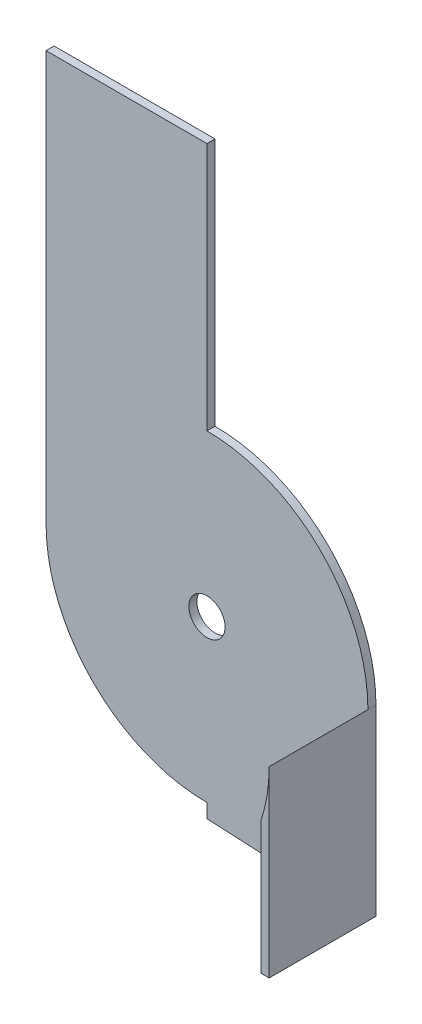
ISO-10303-21;
HEADER;
FILE_DESCRIPTION(('STEP AP214'),'2;1');
FILE_NAME('part.step','',(''),(''),'','','');
FILE_SCHEMA(('AUTOMOTIVE_DESIGN { 1 0 10303 214 1 1 1 1 }'));
ENDSEC;
DATA;
#1=APPLICATION_CONTEXT('core data for automotive mechanical design processes');
#2=APPLICATION_PROTOCOL_DEFINITION('international standard','automotive_design',2000,#1);
#3=PRODUCT_CONTEXT('',#1,'mechanical');
#4=PRODUCT('Part','Part','',(#3));
#5=PRODUCT_RELATED_PRODUCT_CATEGORY('part','',(#4));
#6=PRODUCT_DEFINITION_FORMATION('','',#4);
#7=PRODUCT_DEFINITION_CONTEXT('part definition',#1,'design');
#8=PRODUCT_DEFINITION('design','',#6,#7);
#9=PRODUCT_DEFINITION_SHAPE('','',#8);
#10=(LENGTH_UNIT() NAMED_UNIT(*) SI_UNIT(.MILLI.,.METRE.));
#11=(NAMED_UNIT(*) PLANE_ANGLE_UNIT() SI_UNIT($,.RADIAN.));
#12=(NAMED_UNIT(*) SI_UNIT($,.STERADIAN.) SOLID_ANGLE_UNIT());
#13=UNCERTAINTY_MEASURE_WITH_UNIT(LENGTH_MEASURE(1.E-05),#10,'distance_accuracy_value','');
#14=(GEOMETRIC_REPRESENTATION_CONTEXT(3) GLOBAL_UNCERTAINTY_ASSIGNED_CONTEXT((#13)) GLOBAL_UNIT_ASSIGNED_CONTEXT((#10,
#11,#12)) REPRESENTATION_CONTEXT('',''));
#15=CARTESIAN_POINT('',(0.,0.,0.));
#16=DIRECTION('',(0.,0.,1.));
#17=DIRECTION('',(1.,0.,0.));
#18=AXIS2_PLACEMENT_3D('',#15,#16,#17);
#19=CARTESIAN_POINT('',(0.,0.,2.));
#20=DIRECTION('',(0.,0.,1.));
#21=DIRECTION('',(1.,0.,0.));
#22=AXIS2_PLACEMENT_3D('',#19,#20,#21);
#23=PLANE('',#22);
#24=DIRECTION('',(0.,1.,0.));
#25=VECTOR('',#24,1.);
#26=CARTESIAN_POINT('',(28.,0.,2.));
#27=LINE('',#26,#25);
#28=CARTESIAN_POINT('',(28.,-44.9,2.));
#29=VERTEX_POINT('',#28);
#30=CARTESIAN_POINT('',(28.,-28.5657137141714,2.));
#31=VERTEX_POINT('',#30);
#32=EDGE_CURVE('E263',#29,#31,#27,.T.);
#33=ORIENTED_EDGE('',*,*,#32,.T.);
#34=CARTESIAN_POINT('',(0.,0.,2.));
#35=DIRECTION('',(0.,0.,1.));
#36=DIRECTION('',(1.,0.,0.));
#37=AXIS2_PLACEMENT_3D('',#34,#35,#36);
#38=CIRCLE('',#37,40.);
#39=CARTESIAN_POINT('',(40.,0.,2.));
#40=VERTEX_POINT('',#39);
#41=EDGE_CURVE('E142',#31,#40,#38,.T.);
#42=ORIENTED_EDGE('',*,*,#41,.T.);
#43=CARTESIAN_POINT('',(0.,0.,2.));
#44=DIRECTION('',(0.,0.,1.));
#45=DIRECTION('',(1.,0.,0.));
#46=AXIS2_PLACEMENT_3D('',#43,#44,#45);
#47=CIRCLE('',#46,40.);
#48=CARTESIAN_POINT('',(0.,40.,2.));
#49=VERTEX_POINT('',#48);
#50=EDGE_CURVE('E38',#40,#49,#47,.T.);
#51=ORIENTED_EDGE('',*,*,#50,.T.);
#52=DIRECTION('',(0.,1.,0.));
#53=VECTOR('',#52,1.);
#54=CARTESIAN_POINT('',(0.,101.855940277345,2.));
#55=LINE('',#54,#53);
#56=CARTESIAN_POINT('',(0.,101.855940277345,2.));
#57=VERTEX_POINT('',#56);
#58=EDGE_CURVE('E251',#49,#57,#55,.T.);
#59=ORIENTED_EDGE('',*,*,#58,.T.);
#60=DIRECTION('',(-1.,0.,0.));
#61=VECTOR('',#60,1.);
#62=CARTESIAN_POINT('',(-40.,101.855940277345,2.));
#63=LINE('',#62,#61);
#64=CARTESIAN_POINT('',(-40.,101.855940277345,2.));
#65=VERTEX_POINT('',#64);
#66=EDGE_CURVE('E248',#57,#65,#63,.T.);
#67=ORIENTED_EDGE('',*,*,#66,.T.);
#68=DIRECTION('',(0.,-1.,0.));
#69=VECTOR('',#68,1.);
#70=CARTESIAN_POINT('',(-40.,0.,2.));
#71=LINE('',#70,#69);
#72=CARTESIAN_POINT('',(-40.,0.,2.));
#73=VERTEX_POINT('',#72);
#74=EDGE_CURVE('E291',#65,#73,#71,.T.);
#75=ORIENTED_EDGE('',*,*,#74,.T.);
#76=CARTESIAN_POINT('',(0.,0.,2.));
#77=DIRECTION('',(0.,0.,1.));
#78=DIRECTION('',(1.,0.,0.));
#79=AXIS2_PLACEMENT_3D('',#76,#77,#78);
#80=CIRCLE('',#79,40.);
#81=CARTESIAN_POINT('',(0.,-40.,2.));
#82=VERTEX_POINT('',#81);
#83=EDGE_CURVE('E280',#73,#82,#80,.T.);
#84=ORIENTED_EDGE('',*,*,#83,.T.);
#85=DIRECTION('',(0.,-1.,0.));
#86=VECTOR('',#85,1.);
#87=CARTESIAN_POINT('',(0.,-45.,2.));
#88=LINE('',#87,#86);
#89=CARTESIAN_POINT('',(0.,-43.5,2.));
#90=VERTEX_POINT('',#89);
#91=EDGE_CURVE('E284',#82,#90,#88,.T.);
#92=ORIENTED_EDGE('',*,*,#91,.T.);
#93=DIRECTION('',(0.998752338877845,-0.0499376169438923,0.));
#94=VECTOR('',#93,1.);
#95=CARTESIAN_POINT('',(40.,-45.5,2.));
#96=LINE('',#95,#94);
#97=EDGE_CURVE('E159',#90,#29,#96,.T.);
#98=ORIENTED_EDGE('',*,*,#97,.T.);
#99=EDGE_LOOP('',(#33,#42,#51,#59,#67,#75,#84,#92,#98));
#100=FACE_BOUND('',#99,.T.);
#101=CARTESIAN_POINT('',(0.,0.,2.));
#102=DIRECTION('',(0.,0.,1.));
#103=DIRECTION('',(1.,0.,0.));
#104=AXIS2_PLACEMENT_3D('',#101,#102,#103);
#105=CIRCLE('',#104,4.5);
#106=CARTESIAN_POINT('',(4.5,0.,2.));
#107=VERTEX_POINT('',#106);
#108=EDGE_CURVE('E269',#107,#107,#105,.T.);
#109=ORIENTED_EDGE('',*,*,#108,.F.);
#110=EDGE_LOOP('',(#109));
#111=FACE_BOUND('',#110,.T.);
#112=ADVANCED_FACE('F33',(#100,#111),#23,.T.);
#113=CARTESIAN_POINT('',(0.,0.,40.));
#114=DIRECTION('',(0.,0.,-1.));
#115=DIRECTION('',(-1.,0.,0.));
#116=AXIS2_PLACEMENT_3D('',#113,#114,#115);
#117=CYLINDRICAL_SURFACE('',#116,40.);
#118=DIRECTION('',(0.,0.,-1.));
#119=VECTOR('',#118,1.);
#120=CARTESIAN_POINT('',(0.,40.,40.));
#121=LINE('',#120,#119);
#122=CARTESIAN_POINT('',(0.,40.,0.));
#123=VERTEX_POINT('',#122);
#124=EDGE_CURVE('E273',#49,#123,#121,.T.);
#125=ORIENTED_EDGE('',*,*,#124,.F.);
#126=ORIENTED_EDGE('',*,*,#50,.F.);
#127=DIRECTION('',(0.,0.,-1.));
#128=VECTOR('',#127,1.);
#129=CARTESIAN_POINT('',(40.,0.,40.));
#130=LINE('',#129,#128);
#131=CARTESIAN_POINT('',(40.,0.,0.));
#132=VERTEX_POINT('',#131);
#133=EDGE_CURVE('E243',#40,#132,#130,.T.);
#134=ORIENTED_EDGE('',*,*,#133,.T.);
#135=CARTESIAN_POINT('',(0.,0.,0.));
#136=DIRECTION('',(0.,0.,1.));
#137=DIRECTION('',(1.,0.,0.));
#138=AXIS2_PLACEMENT_3D('',#135,#136,#137);
#139=CIRCLE('',#138,40.);
#140=EDGE_CURVE('E173',#132,#123,#139,.T.);
#141=ORIENTED_EDGE('',*,*,#140,.T.);
#142=EDGE_LOOP('',(#125,#126,#134,#141));
#143=FACE_BOUND('',#142,.T.);
#144=ADVANCED_FACE('F190',(#143),#117,.T.);
#145=CARTESIAN_POINT('',(38.,-45.5,26.5412424775573));
#146=DIRECTION('',(0.,0.,1.));
#147=DIRECTION('',(1.,0.,0.));
#148=AXIS2_PLACEMENT_3D('',#145,#146,#147);
#149=PLANE('',#148);
#150=DIRECTION('',(0.,-1.,0.));
#151=VECTOR('',#150,1.);
#152=CARTESIAN_POINT('',(40.,-45.5,26.5412424775573));
#153=LINE('',#152,#151);
#154=CARTESIAN_POINT('',(40.,0.,26.5412424775573));
#155=VERTEX_POINT('',#154);
#156=CARTESIAN_POINT('',(40.,-45.5,26.5412424775573));
#157=VERTEX_POINT('',#156);
#158=EDGE_CURVE('E170',#155,#157,#153,.T.);
#159=ORIENTED_EDGE('',*,*,#158,.F.);
#160=CARTESIAN_POINT('',(0.,0.,26.5412424775573));
#161=DIRECTION('',(0.,0.,1.));
#162=DIRECTION('',(1.,0.,0.));
#163=AXIS2_PLACEMENT_3D('',#160,#161,#162);
#164=CIRCLE('',#163,40.);
#165=CARTESIAN_POINT('',(38.,-12.4899959967968,26.5412424775573));
#166=VERTEX_POINT('',#165);
#167=EDGE_CURVE('E53',#155,#166,#164,.F.);
#168=ORIENTED_EDGE('',*,*,#167,.T.);
#169=DIRECTION('',(0.,-1.,0.));
#170=VECTOR('',#169,1.);
#171=CARTESIAN_POINT('',(38.,0.,26.5412424775573));
#172=LINE('',#171,#170);
#173=CARTESIAN_POINT('',(38.,-45.5,26.5412424775573));
#174=VERTEX_POINT('',#173);
#175=EDGE_CURVE('E167',#166,#174,#172,.T.);
#176=ORIENTED_EDGE('',*,*,#175,.T.);
#177=DIRECTION('',(1.,0.,0.));
#178=VECTOR('',#177,1.);
#179=CARTESIAN_POINT('',(38.,-45.5,26.5412424775573));
#180=LINE('',#179,#178);
#181=EDGE_CURVE('E156',#174,#157,#180,.T.);
#182=ORIENTED_EDGE('',*,*,#181,.T.);
#183=EDGE_LOOP('',(#159,#168,#176,#182));
#184=FACE_BOUND('',#183,.T.);
#185=ADVANCED_FACE('F193',(#184),#149,.T.);
#186=CARTESIAN_POINT('',(38.,0.,0.));
#187=DIRECTION('',(1.,0.,0.));
#188=DIRECTION('',(0.,1.,0.));
#189=AXIS2_PLACEMENT_3D('',#186,#187,#188);
#190=PLANE('',#189);
#191=DIRECTION('',(0.,0.,-1.));
#192=VECTOR('',#191,1.);
#193=CARTESIAN_POINT('',(38.,-12.4899959967968,84.));
#194=LINE('',#193,#192);
#195=CARTESIAN_POINT('',(38.,-12.4899959967968,12.));
#196=VERTEX_POINT('',#195);
#197=EDGE_CURVE('E11',#196,#166,#194,.F.);
#198=ORIENTED_EDGE('',*,*,#197,.F.);
#199=DIRECTION('',(0.,1.,0.));
#200=VECTOR('',#199,1.);
#201=CARTESIAN_POINT('',(38.,0.,12.));
#202=LINE('',#201,#200);
#203=CARTESIAN_POINT('',(38.,-45.4,12.));
#204=VERTEX_POINT('',#203);
#205=EDGE_CURVE('E315',#196,#204,#202,.F.);
#206=ORIENTED_EDGE('',*,*,#205,.T.);
#207=DIRECTION('',(0.,0.,-1.));
#208=VECTOR('',#207,1.);
#209=CARTESIAN_POINT('',(38.,-45.4,0.));
#210=LINE('',#209,#208);
#211=CARTESIAN_POINT('',(38.,-45.4,2.));
#212=VERTEX_POINT('',#211);
#213=EDGE_CURVE('E150',#204,#212,#210,.T.);
#214=ORIENTED_EDGE('',*,*,#213,.T.);
#215=DIRECTION('',(0.,1.,0.));
#216=VECTOR('',#215,1.);
#217=CARTESIAN_POINT('',(38.,-45.5,2.));
#218=LINE('',#217,#216);
#219=CARTESIAN_POINT('',(38.,-45.5,2.));
#220=VERTEX_POINT('',#219);
#221=EDGE_CURVE('E135',#220,#212,#218,.T.);
#222=ORIENTED_EDGE('',*,*,#221,.F.);
#223=DIRECTION('',(0.,0.,-1.));
#224=VECTOR('',#223,1.);
#225=CARTESIAN_POINT('',(38.,-45.5,2.));
#226=LINE('',#225,#224);
#227=EDGE_CURVE('E143',#174,#220,#226,.T.);
#228=ORIENTED_EDGE('',*,*,#227,.F.);
#229=ORIENTED_EDGE('',*,*,#175,.F.);
#230=EDGE_LOOP('',(#198,#206,#214,#222,#228,#229));
#231=FACE_BOUND('',#230,.T.);
#232=ADVANCED_FACE('F147',(#231),#190,.F.);
#233=CARTESIAN_POINT('',(28.,0.,12.));
#234=DIRECTION('',(0.,1.,0.));
#235=DIRECTION('',(-1.,0.,0.));
#236=AXIS2_PLACEMENT_3D('',#233,#234,#235);
#237=CYLINDRICAL_SURFACE('',#236,10.);
#238=CARTESIAN_POINT('',(28.,-28.5657137141714,2.));
#239=CARTESIAN_POINT('',(28.2025228124265,-28.3672074264276,2.0000085537167));
#240=CARTESIAN_POINT('',(28.4028832634662,-28.1665852678706,2.006151328741));
#241=CARTESIAN_POINT('',(28.7989171672831,-27.7615295538624,2.0299894323125));
#242=CARTESIAN_POINT('',(28.9945917660297,-27.5570969524961,2.04768190573324));
#243=CARTESIAN_POINT('',(29.5735668944114,-26.9392322248397,2.11694057982785));
#244=CARTESIAN_POINT('',(29.9494761251845,-26.5205883841425,2.18469274054019));
#245=CARTESIAN_POINT('',(30.6803833588562,-25.6715579807608,2.35857571788483));
#246=CARTESIAN_POINT('',(31.0353274623921,-25.2411449866765,2.46480084166322));
#247=CARTESIAN_POINT('',(31.7225677683226,-24.371822936993,2.71152119480707));
#248=CARTESIAN_POINT('',(32.0548534282544,-23.9329100468939,2.85203223930288));
#249=CARTESIAN_POINT('',(32.5827647858697,-23.2053480961867,3.10891442766447));
#250=CARTESIAN_POINT('',(32.7852005516042,-22.9183893245452,3.21627877404944));
#251=CARTESIAN_POINT('',(33.1802666521376,-22.3425998006927,3.44332147820077));
#252=CARTESIAN_POINT('',(33.3728972999456,-22.0537691085713,3.56299944251));
#253=CARTESIAN_POINT('',(33.7484133971349,-21.4747232883278,3.81423158157918));
#254=CARTESIAN_POINT('',(33.9312939874607,-21.1845075470096,3.94579159151825));
#255=CARTESIAN_POINT('',(34.2871969213171,-20.6034990832447,4.22043185603089));
#256=CARTESIAN_POINT('',(34.4602195843764,-20.3127063798159,4.36351173684332));
#257=CARTESIAN_POINT('',(34.796002823541,-19.7319644071805,4.66075563568618));
#258=CARTESIAN_POINT('',(34.9587868188762,-19.4420147763669,4.8148924935051));
#259=CARTESIAN_POINT('',(35.2745074887202,-18.8631333203035,5.13472199000676));
#260=CARTESIAN_POINT('',(35.4274444155968,-18.5742014691489,5.30041433231032));
#261=CARTESIAN_POINT('',(35.7232754525818,-17.998671843158,5.64371773411044));
#262=CARTESIAN_POINT('',(35.86617793708,-17.7120723028203,5.8213186072109));
#263=CARTESIAN_POINT('',(36.1419063584023,-17.1424223306959,6.18946802351868));
#264=CARTESIAN_POINT('',(36.2747346501886,-16.8593710824476,6.38001352090001));
#265=CARTESIAN_POINT('',(36.4781141554721,-16.4128187415995,6.69518570966189));
#266=CARTESIAN_POINT('',(36.5520235374753,-16.2475133800545,6.81510545345728));
#267=CARTESIAN_POINT('',(36.6960923400329,-15.919449802847,7.0605427800478));
#268=CARTESIAN_POINT('',(36.7662520426529,-15.7566913962458,7.18605994047663));
#269=CARTESIAN_POINT('',(36.9028129156281,-15.4341545088788,7.44355353645612));
#270=CARTESIAN_POINT('',(36.9692064925965,-15.2743824555861,7.57554208656351));
#271=CARTESIAN_POINT('',(37.0978704628682,-14.9591768995677,7.84653681952036));
#272=CARTESIAN_POINT('',(37.160141056774,-14.8037431859747,7.98554266036512));
#273=CARTESIAN_POINT('',(37.280876442328,-14.4970232945411,8.27308301483886));
#274=CARTESIAN_POINT('',(37.3392946731566,-14.3457974178361,8.42170191044942));
#275=CARTESIAN_POINT('',(37.4511482932261,-14.0512031439676,8.72853508911078));
#276=CARTESIAN_POINT('',(37.5045812280189,-13.9078386314194,8.88675403602362));
#277=CARTESIAN_POINT('',(37.6055291104763,-13.6325194872056,9.21378132192473));
#278=CARTESIAN_POINT('',(37.6530628447437,-13.5005290666686,9.38255332896824));
#279=CARTESIAN_POINT('',(37.7412396452091,-13.252025059594,9.7326712313474));
#280=CARTESIAN_POINT('',(37.7818921331831,-13.135490359284,9.91399944717813));
#281=CARTESIAN_POINT('',(37.8533998628707,-12.9279441792743,10.2839805825523));
#282=CARTESIAN_POINT('',(37.8845548352284,-12.8361656023428,10.4721356551194));
#283=CARTESIAN_POINT('',(37.9367983598445,-12.6809345264178,10.8606635581822));
#284=CARTESIAN_POINT('',(37.9579302216612,-12.6173602360844,11.0609795252238));
#285=CARTESIAN_POINT('',(37.9818339420956,-12.5451628621503,11.3856271834982));
#286=CARTESIAN_POINT('',(37.9885851108958,-12.5246858615013,11.5070635799941));
#287=CARTESIAN_POINT('',(37.9976959453536,-12.497006519936,11.7522801520559));
#288=CARTESIAN_POINT('',(38.0000306787746,-12.4898795465237,11.8760696726472));
#289=CARTESIAN_POINT('',(38.,-12.4899959967968,12.));
#290=B_SPLINE_CURVE_WITH_KNOTS('',3,(#238,#239,#240,#241,#242,#243,#244,#245,#246,#247,#248,
#249,#250,#251,#252,#253,#254,#255,#256,#257,#258,#259,#260,#261,#262,#263,#264,#265,#266,#267,
#268,#269,#270,#271,#272,#273,#274,#275,#276,#277,#278,#279,#280,#281,#282,#283,#284,#285,#286,
#287,#288,#289),.UNSPECIFIED.,.F.,.F.,(4,2,2,2,2,2,2,2,2,2,2,2,2,2,2,2,2,2,2,2,2,2,2,2,2,4),(0.,
0.850563043355811,1.70091590408788,3.3988691715542,5.10101304585366,6.8039435604105,
7.90530327094066,9.00662780063768,10.108496153943,11.2103287716283,12.3095418838514,
13.4087268134261,14.5069832226371,15.6049821049618,16.2564375521502,16.9078439251325,
17.5605201312742,18.2131645583097,18.8726278521326,19.53241412983,20.1900421791279,
20.8467623925839,21.4798678759267,22.1102122301163,22.4794578211721,22.8507817758367),.UNSPECIFIED.);
#291=EDGE_CURVE('E45',#31,#196,#290,.T.);
#292=ORIENTED_EDGE('',*,*,#291,.F.);
#293=ORIENTED_EDGE('',*,*,#32,.F.);
#294=CARTESIAN_POINT('',(28.,-44.9,12.));
#295=DIRECTION('',(-0.0499376169438923,-0.998752338877845,0.));
#296=DIRECTION('',(-0.998752338877845,0.0499376169438923,0.));
#297=AXIS2_PLACEMENT_3D('',#294,#295,#296);
#298=ELLIPSE('',#297,10.0124921972504,10.);
#299=EDGE_CURVE('E151',#204,#29,#298,.F.);
#300=ORIENTED_EDGE('',*,*,#299,.F.);
#301=ORIENTED_EDGE('',*,*,#205,.F.);
#302=EDGE_LOOP('',(#292,#293,#300,#301));
#303=FACE_BOUND('',#302,.T.);
#304=ADVANCED_FACE('F184',(#303),#237,.F.);
#305=CARTESIAN_POINT('',(-40.,101.855940277345,40.));
#306=DIRECTION('',(0.,-1.,0.));
#307=DIRECTION('',(0.,0.,-1.));
#308=AXIS2_PLACEMENT_3D('',#305,#306,#307);
#309=PLANE('',#308);
#310=ORIENTED_EDGE('',*,*,#66,.F.);
#311=DIRECTION('',(0.,0.,-1.));
#312=VECTOR('',#311,1.);
#313=CARTESIAN_POINT('',(0.,101.855940277345,40.));
#314=LINE('',#313,#312);
#315=CARTESIAN_POINT('',(0.,101.855940277345,0.));
#316=VERTEX_POINT('',#315);
#317=EDGE_CURVE('E278',#57,#316,#314,.T.);
#318=ORIENTED_EDGE('',*,*,#317,.T.);
#319=DIRECTION('',(-1.,0.,0.));
#320=VECTOR('',#319,1.);
#321=CARTESIAN_POINT('',(-40.,101.855940277345,0.));
#322=LINE('',#321,#320);
#323=CARTESIAN_POINT('',(-40.,101.855940277345,0.));
#324=VERTEX_POINT('',#323);
#325=EDGE_CURVE('E277',#316,#324,#322,.T.);
#326=ORIENTED_EDGE('',*,*,#325,.T.);
#327=DIRECTION('',(0.,0.,-1.));
#328=VECTOR('',#327,1.);
#329=CARTESIAN_POINT('',(-40.,101.855940277345,40.));
#330=LINE('',#329,#328);
#331=EDGE_CURVE('E281',#65,#324,#330,.T.);
#332=ORIENTED_EDGE('',*,*,#331,.F.);
#333=EDGE_LOOP('',(#310,#318,#326,#332));
#334=FACE_BOUND('',#333,.T.);
#335=ADVANCED_FACE('F188',(#334),#309,.F.);
#336=CARTESIAN_POINT('',(0.,101.855940277345,40.));
#337=DIRECTION('',(-1.,0.,0.));
#338=DIRECTION('',(0.,0.,1.));
#339=AXIS2_PLACEMENT_3D('',#336,#337,#338);
#340=PLANE('',#339);
#341=ORIENTED_EDGE('',*,*,#58,.F.);
#342=ORIENTED_EDGE('',*,*,#124,.T.);
#343=DIRECTION('',(0.,1.,0.));
#344=VECTOR('',#343,1.);
#345=CARTESIAN_POINT('',(0.,101.855940277345,0.));
#346=LINE('',#345,#344);
#347=EDGE_CURVE('E276',#123,#316,#346,.T.);
#348=ORIENTED_EDGE('',*,*,#347,.T.);
#349=ORIENTED_EDGE('',*,*,#317,.F.);
#350=EDGE_LOOP('',(#341,#342,#348,#349));
#351=FACE_BOUND('',#350,.T.);
#352=ADVANCED_FACE('F208',(#351),#340,.F.);
#353=CARTESIAN_POINT('',(-40.,0.,40.));
#354=DIRECTION('',(1.,0.,0.));
#355=DIRECTION('',(0.,0.,-1.));
#356=AXIS2_PLACEMENT_3D('',#353,#354,#355);
#357=PLANE('',#356);
#358=ORIENTED_EDGE('',*,*,#74,.F.);
#359=ORIENTED_EDGE('',*,*,#331,.T.);
#360=DIRECTION('',(0.,-1.,0.));
#361=VECTOR('',#360,1.);
#362=CARTESIAN_POINT('',(-40.,0.,0.));
#363=LINE('',#362,#361);
#364=CARTESIAN_POINT('',(-40.,0.,0.));
#365=VERTEX_POINT('',#364);
#366=EDGE_CURVE('E283',#324,#365,#363,.T.);
#367=ORIENTED_EDGE('',*,*,#366,.T.);
#368=DIRECTION('',(0.,0.,-1.));
#369=VECTOR('',#368,1.);
#370=CARTESIAN_POINT('',(-40.,0.,40.));
#371=LINE('',#370,#369);
#372=EDGE_CURVE('E256',#73,#365,#371,.T.);
#373=ORIENTED_EDGE('',*,*,#372,.F.);
#374=EDGE_LOOP('',(#358,#359,#367,#373));
#375=FACE_BOUND('',#374,.T.);
#376=ADVANCED_FACE('F204',(#375),#357,.F.);
#377=CARTESIAN_POINT('',(0.,0.,40.));
#378=DIRECTION('',(0.,0.,-1.));
#379=DIRECTION('',(-1.,0.,0.));
#380=AXIS2_PLACEMENT_3D('',#377,#378,#379);
#381=CYLINDRICAL_SURFACE('',#380,40.);
#382=ORIENTED_EDGE('',*,*,#83,.F.);
#383=ORIENTED_EDGE('',*,*,#372,.T.);
#384=CARTESIAN_POINT('',(0.,0.,0.));
#385=DIRECTION('',(0.,0.,1.));
#386=DIRECTION('',(1.,0.,0.));
#387=AXIS2_PLACEMENT_3D('',#384,#385,#386);
#388=CIRCLE('',#387,40.);
#389=CARTESIAN_POINT('',(0.,-40.,0.));
#390=VERTEX_POINT('',#389);
#391=EDGE_CURVE('E177',#365,#390,#388,.T.);
#392=ORIENTED_EDGE('',*,*,#391,.T.);
#393=DIRECTION('',(0.,0.,-1.));
#394=VECTOR('',#393,1.);
#395=CARTESIAN_POINT('',(0.,-40.,40.));
#396=LINE('',#395,#394);
#397=EDGE_CURVE('E270',#82,#390,#396,.T.);
#398=ORIENTED_EDGE('',*,*,#397,.F.);
#399=EDGE_LOOP('',(#382,#383,#392,#398));
#400=FACE_BOUND('',#399,.T.);
#401=ADVANCED_FACE('F200',(#400),#381,.T.);
#402=CARTESIAN_POINT('',(40.,0.,40.));
#403=DIRECTION('',(-1.,0.,0.));
#404=DIRECTION('',(0.,-1.,0.));
#405=AXIS2_PLACEMENT_3D('',#402,#403,#404);
#406=PLANE('',#405);
#407=ORIENTED_EDGE('',*,*,#133,.F.);
#408=DIRECTION('',(0.,0.,-1.));
#409=VECTOR('',#408,1.);
#410=CARTESIAN_POINT('',(40.,0.,84.));
#411=LINE('',#410,#409);
#412=EDGE_CURVE('E172',#40,#155,#411,.F.);
#413=ORIENTED_EDGE('',*,*,#412,.T.);
#414=ORIENTED_EDGE('',*,*,#158,.T.);
#415=DIRECTION('',(0.,0.,-1.));
#416=VECTOR('',#415,1.);
#417=CARTESIAN_POINT('',(40.,-45.5,2.));
#418=LINE('',#417,#416);
#419=CARTESIAN_POINT('',(40.,-45.5,2.));
#420=VERTEX_POINT('',#419);
#421=EDGE_CURVE('E161',#157,#420,#418,.T.);
#422=ORIENTED_EDGE('',*,*,#421,.T.);
#423=DIRECTION('',(0.,0.,1.));
#424=VECTOR('',#423,1.);
#425=CARTESIAN_POINT('',(40.,-45.5,-40.0499687890016));
#426=LINE('',#425,#424);
#427=CARTESIAN_POINT('',(40.,-45.5,0.));
#428=VERTEX_POINT('',#427);
#429=EDGE_CURVE('E308',#428,#420,#426,.T.);
#430=ORIENTED_EDGE('',*,*,#429,.F.);
#431=DIRECTION('',(0.,1.,0.));
#432=VECTOR('',#431,1.);
#433=CARTESIAN_POINT('',(40.,0.,0.));
#434=LINE('',#433,#432);
#435=EDGE_CURVE('E246',#428,#132,#434,.T.);
#436=ORIENTED_EDGE('',*,*,#435,.T.);
#437=EDGE_LOOP('',(#407,#413,#414,#422,#430,#436));
#438=FACE_BOUND('',#437,.T.);
#439=ADVANCED_FACE('F203',(#438),#406,.F.);
#440=CARTESIAN_POINT('',(0.,0.,0.));
#441=DIRECTION('',(0.,0.,1.));
#442=DIRECTION('',(1.,0.,0.));
#443=AXIS2_PLACEMENT_3D('',#440,#441,#442);
#444=PLANE('',#443);
#445=ORIENTED_EDGE('',*,*,#435,.F.);
#446=DIRECTION('',(-0.998752338877845,0.0499376169438923,0.));
#447=VECTOR('',#446,1.);
#448=CARTESIAN_POINT('',(40.,-45.5,0.));
#449=LINE('',#448,#447);
#450=CARTESIAN_POINT('',(0.,-43.5,0.));
#451=VERTEX_POINT('',#450);
#452=EDGE_CURVE('E259',#428,#451,#449,.T.);
#453=ORIENTED_EDGE('',*,*,#452,.T.);
#454=DIRECTION('',(0.,1.,0.));
#455=VECTOR('',#454,1.);
#456=CARTESIAN_POINT('',(0.,-45.,0.));
#457=LINE('',#456,#455);
#458=EDGE_CURVE('E272',#451,#390,#457,.T.);
#459=ORIENTED_EDGE('',*,*,#458,.T.);
#460=ORIENTED_EDGE('',*,*,#391,.F.);
#461=ORIENTED_EDGE('',*,*,#366,.F.);
#462=ORIENTED_EDGE('',*,*,#325,.F.);
#463=ORIENTED_EDGE('',*,*,#347,.F.);
#464=ORIENTED_EDGE('',*,*,#140,.F.);
#465=EDGE_LOOP('',(#445,#453,#459,#460,#461,#462,#463,#464));
#466=FACE_BOUND('',#465,.T.);
#467=CARTESIAN_POINT('',(0.,0.,0.));
#468=DIRECTION('',(0.,0.,1.));
#469=DIRECTION('',(1.,0.,0.));
#470=AXIS2_PLACEMENT_3D('',#467,#468,#469);
#471=CIRCLE('',#470,4.5);
#472=CARTESIAN_POINT('',(4.5,0.,0.));
#473=VERTEX_POINT('',#472);
#474=EDGE_CURVE('E298',#473,#473,#471,.F.);
#475=ORIENTED_EDGE('',*,*,#474,.F.);
#476=EDGE_LOOP('',(#475));
#477=FACE_BOUND('',#476,.T.);
#478=ADVANCED_FACE('F198',(#466,#477),#444,.F.);
#479=CARTESIAN_POINT('',(0.,-45.,40.));
#480=DIRECTION('',(1.,0.,0.));
#481=DIRECTION('',(0.,0.,-1.));
#482=AXIS2_PLACEMENT_3D('',#479,#480,#481);
#483=PLANE('',#482);
#484=ORIENTED_EDGE('',*,*,#91,.F.);
#485=ORIENTED_EDGE('',*,*,#397,.T.);
#486=ORIENTED_EDGE('',*,*,#458,.F.);
#487=DIRECTION('',(0.,0.,1.));
#488=VECTOR('',#487,1.);
#489=CARTESIAN_POINT('',(0.,-43.5,-40.0281151192509));
#490=LINE('',#489,#488);
#491=EDGE_CURVE('E267',#451,#90,#490,.T.);
#492=ORIENTED_EDGE('',*,*,#491,.T.);
#493=EDGE_LOOP('',(#484,#485,#486,#492));
#494=FACE_BOUND('',#493,.T.);
#495=ADVANCED_FACE('F194',(#494),#483,.F.);
#496=CARTESIAN_POINT('',(0.,0.,-12.7279220613579));
#497=DIRECTION('',(0.,0.,1.));
#498=DIRECTION('',(1.,0.,0.));
#499=AXIS2_PLACEMENT_3D('',#496,#497,#498);
#500=CYLINDRICAL_SURFACE('',#499,4.5);
#501=CARTESIAN_POINT('',(4.5,0.,2.));
#502=CARTESIAN_POINT('',(4.5,0.,1.97916666666667));
#503=CARTESIAN_POINT('',(4.5,0.,1.95833333333333));
#504=CARTESIAN_POINT('',(4.5,0.,1.91666666666667));
#505=CARTESIAN_POINT('',(4.5,0.,1.89583333333333));
#506=CARTESIAN_POINT('',(4.5,0.,1.85416666666667));
#507=CARTESIAN_POINT('',(4.5,0.,1.83333333333333));
#508=CARTESIAN_POINT('',(4.5,0.,1.79166666666667));
#509=CARTESIAN_POINT('',(4.5,0.,1.77083333333333));
#510=CARTESIAN_POINT('',(4.5,0.,1.72916666666667));
#511=CARTESIAN_POINT('',(4.5,0.,1.70833333333333));
#512=CARTESIAN_POINT('',(4.5,0.,1.66666666666667));
#513=CARTESIAN_POINT('',(4.5,0.,1.64583333333333));
#514=CARTESIAN_POINT('',(4.5,0.,1.60416666666667));
#515=CARTESIAN_POINT('',(4.5,0.,1.58333333333333));
#516=CARTESIAN_POINT('',(4.5,0.,1.54166666666667));
#517=CARTESIAN_POINT('',(4.5,0.,1.52083333333333));
#518=CARTESIAN_POINT('',(4.5,0.,1.47916666666667));
#519=CARTESIAN_POINT('',(4.5,0.,1.45833333333333));
#520=CARTESIAN_POINT('',(4.5,0.,1.41666666666667));
#521=CARTESIAN_POINT('',(4.5,0.,1.39583333333333));
#522=CARTESIAN_POINT('',(4.5,0.,1.35416666666667));
#523=CARTESIAN_POINT('',(4.5,0.,1.33333333333333));
#524=CARTESIAN_POINT('',(4.5,0.,1.29166666666667));
#525=CARTESIAN_POINT('',(4.5,0.,1.27083333333333));
#526=CARTESIAN_POINT('',(4.5,0.,1.22916666666667));
#527=CARTESIAN_POINT('',(4.5,0.,1.20833333333333));
#528=CARTESIAN_POINT('',(4.5,0.,1.16666666666667));
#529=CARTESIAN_POINT('',(4.5,0.,1.14583333333333));
#530=CARTESIAN_POINT('',(4.5,0.,1.10416666666667));
#531=CARTESIAN_POINT('',(4.5,0.,1.08333333333333));
#532=CARTESIAN_POINT('',(4.5,0.,1.04166666666667));
#533=CARTESIAN_POINT('',(4.5,0.,1.02083333333333));
#534=CARTESIAN_POINT('',(4.5,0.,0.979166666666666));
#535=CARTESIAN_POINT('',(4.5,0.,0.958333333333332));
#536=CARTESIAN_POINT('',(4.5,0.,0.916666666666666));
#537=CARTESIAN_POINT('',(4.5,0.,0.895833333333332));
#538=CARTESIAN_POINT('',(4.5,0.,0.854166666666666));
#539=CARTESIAN_POINT('',(4.5,0.,0.833333333333332));
#540=CARTESIAN_POINT('',(4.5,0.,0.791666666666666));
#541=CARTESIAN_POINT('',(4.5,0.,0.770833333333332));
#542=CARTESIAN_POINT('',(4.5,0.,0.729166666666666));
#543=CARTESIAN_POINT('',(4.5,0.,0.708333333333332));
#544=CARTESIAN_POINT('',(4.5,0.,0.666666666666666));
#545=CARTESIAN_POINT('',(4.5,0.,0.645833333333332));
#546=CARTESIAN_POINT('',(4.5,0.,0.604166666666666));
#547=CARTESIAN_POINT('',(4.5,0.,0.583333333333332));
#548=CARTESIAN_POINT('',(4.5,0.,0.541666666666665));
#549=CARTESIAN_POINT('',(4.5,0.,0.520833333333332));
#550=CARTESIAN_POINT('',(4.5,0.,0.479166666666665));
#551=CARTESIAN_POINT('',(4.5,0.,0.458333333333332));
#552=CARTESIAN_POINT('',(4.5,0.,0.416666666666665));
#553=CARTESIAN_POINT('',(4.5,0.,0.395833333333332));
#554=CARTESIAN_POINT('',(4.5,0.,0.354166666666665));
#555=CARTESIAN_POINT('',(4.5,0.,0.333333333333332));
#556=CARTESIAN_POINT('',(4.5,0.,0.291666666666665));
#557=CARTESIAN_POINT('',(4.5,0.,0.270833333333332));
#558=CARTESIAN_POINT('',(4.5,0.,0.229166666666665));
#559=CARTESIAN_POINT('',(4.5,0.,0.208333333333332));
#560=CARTESIAN_POINT('',(4.5,0.,0.166666666666665));
#561=CARTESIAN_POINT('',(4.5,0.,0.145833333333332));
#562=CARTESIAN_POINT('',(4.5,0.,0.104166666666665));
#563=CARTESIAN_POINT('',(4.5,0.,0.0833333333333317));
#564=CARTESIAN_POINT('',(4.5,0.,0.041666666666665));
#565=CARTESIAN_POINT('',(4.5,0.,0.0208333333333316));
#566=CARTESIAN_POINT('',(4.5,0.,0.));
#567=B_SPLINE_CURVE_WITH_KNOTS('',3,(#501,#502,#503,#504,#505,#506,#507,#508,#509,#510,#511,
#512,#513,#514,#515,#516,#517,#518,#519,#520,#521,#522,#523,#524,#525,#526,#527,#528,#529,#530,
#531,#532,#533,#534,#535,#536,#537,#538,#539,#540,#541,#542,#543,#544,#545,#546,#547,#548,#549,
#550,#551,#552,#553,#554,#555,#556,#557,#558,#559,#560,#561,#562,#563,#564,#565,#566),
.UNSPECIFIED.,.F.,.F.,(4,2,2,2,2,2,2,2,2,2,2,2,2,2,2,2,2,2,2,2,2,2,2,2,2,2,2,2,2,2,2,2,4),(0.,
0.0625000000000001,0.125,0.1875,0.25,0.3125,0.375,0.4375,0.5,0.5625,0.625000000000001,
0.687500000000001,0.750000000000001,0.812500000000001,0.875000000000001,0.937500000000001,1.,
1.0625,1.125,1.1875,1.25,1.3125,1.375,1.4375,1.5,1.5625,1.625,1.6875,1.75,1.8125,1.875,1.9375,
2.),.UNSPECIFIED.);
#568=EDGE_CURVE('BSEAM197',#107,#473,#567,.T.);
#569=ORIENTED_EDGE('',*,*,#108,.T.);
#570=ORIENTED_EDGE('',*,*,#474,.T.);
#571=ORIENTED_EDGE('',*,*,#568,.T.);
#572=ORIENTED_EDGE('',*,*,#568,.F.);
#573=EDGE_LOOP('',(#569,#571,#570,#572));
#574=FACE_BOUND('',#573,.T.);
#575=ADVANCED_FACE('F197',(#574),#500,.F.);
#576=CARTESIAN_POINT('',(40.,-45.5,-40.0499687890016));
#577=DIRECTION('',(-0.0499376169438923,-0.998752338877845,0.));
#578=DIRECTION('',(0.998752338877845,-0.0499376169438923,0.));
#579=AXIS2_PLACEMENT_3D('',#576,#577,#578);
#580=PLANE('',#579);
#581=ORIENTED_EDGE('',*,*,#452,.F.);
#582=ORIENTED_EDGE('',*,*,#429,.T.);
#583=EDGE_CURVE('E137',#212,#420,#96,.T.);
#584=ORIENTED_EDGE('',*,*,#583,.F.);
#585=ORIENTED_EDGE('',*,*,#213,.F.);
#586=ORIENTED_EDGE('',*,*,#299,.T.);
#587=ORIENTED_EDGE('',*,*,#97,.F.);
#588=ORIENTED_EDGE('',*,*,#491,.F.);
#589=EDGE_LOOP('',(#581,#582,#584,#585,#586,#587,#588));
#590=FACE_BOUND('',#589,.T.);
#591=ADVANCED_FACE('F218',(#590),#580,.T.);
#592=CARTESIAN_POINT('',(38.,0.,2.));
#593=DIRECTION('',(0.,0.,-1.));
#594=DIRECTION('',(-1.,0.,0.));
#595=AXIS2_PLACEMENT_3D('',#592,#593,#594);
#596=PLANE('',#595);
#597=ORIENTED_EDGE('',*,*,#221,.T.);
#598=ORIENTED_EDGE('',*,*,#583,.T.);
#599=DIRECTION('',(1.,0.,0.));
#600=VECTOR('',#599,1.);
#601=CARTESIAN_POINT('',(38.,-45.5,2.));
#602=LINE('',#601,#600);
#603=EDGE_CURVE('E132',#220,#420,#602,.T.);
#604=ORIENTED_EDGE('',*,*,#603,.F.);
#605=EDGE_LOOP('',(#597,#598,#604));
#606=FACE_BOUND('',#605,.T.);
#607=ADVANCED_FACE('F134',(#606),#596,.T.);
#608=CARTESIAN_POINT('',(38.,-45.5,2.));
#609=DIRECTION('',(0.,-1.,0.));
#610=DIRECTION('',(1.,0.,0.));
#611=AXIS2_PLACEMENT_3D('',#608,#609,#610);
#612=PLANE('',#611);
#613=ORIENTED_EDGE('',*,*,#421,.F.);
#614=ORIENTED_EDGE('',*,*,#181,.F.);
#615=ORIENTED_EDGE('',*,*,#227,.T.);
#616=ORIENTED_EDGE('',*,*,#603,.T.);
#617=EDGE_LOOP('',(#613,#614,#615,#616));
#618=FACE_BOUND('',#617,.T.);
#619=ADVANCED_FACE('F154',(#618),#612,.T.);
#620=CARTESIAN_POINT('',(0.,0.,84.));
#621=DIRECTION('',(0.,0.,-1.));
#622=DIRECTION('',(-1.,0.,0.));
#623=AXIS2_PLACEMENT_3D('',#620,#621,#622);
#624=CYLINDRICAL_SURFACE('',#623,40.);
#625=ORIENTED_EDGE('',*,*,#41,.F.);
#626=ORIENTED_EDGE('',*,*,#291,.T.);
#627=ORIENTED_EDGE('',*,*,#197,.T.);
#628=ORIENTED_EDGE('',*,*,#167,.F.);
#629=ORIENTED_EDGE('',*,*,#412,.F.);
#630=EDGE_LOOP('',(#625,#626,#627,#628,#629));
#631=FACE_BOUND('',#630,.T.);
#632=ADVANCED_FACE('F35',(#631),#624,.F.);
#633=CLOSED_SHELL('',(#112,#144,#185,#232,#304,#335,#352,#376,#401,#439,#478,#495,#575,#591,
#607,#619,#632));
#634=MANIFOLD_SOLID_BREP('B2',#633);
#635=ADVANCED_BREP_SHAPE_REPRESENTATION('',(#18,#634),#14);
#636=SHAPE_DEFINITION_REPRESENTATION(#9,#635);
ENDSEC;
END-ISO-10303-21;
